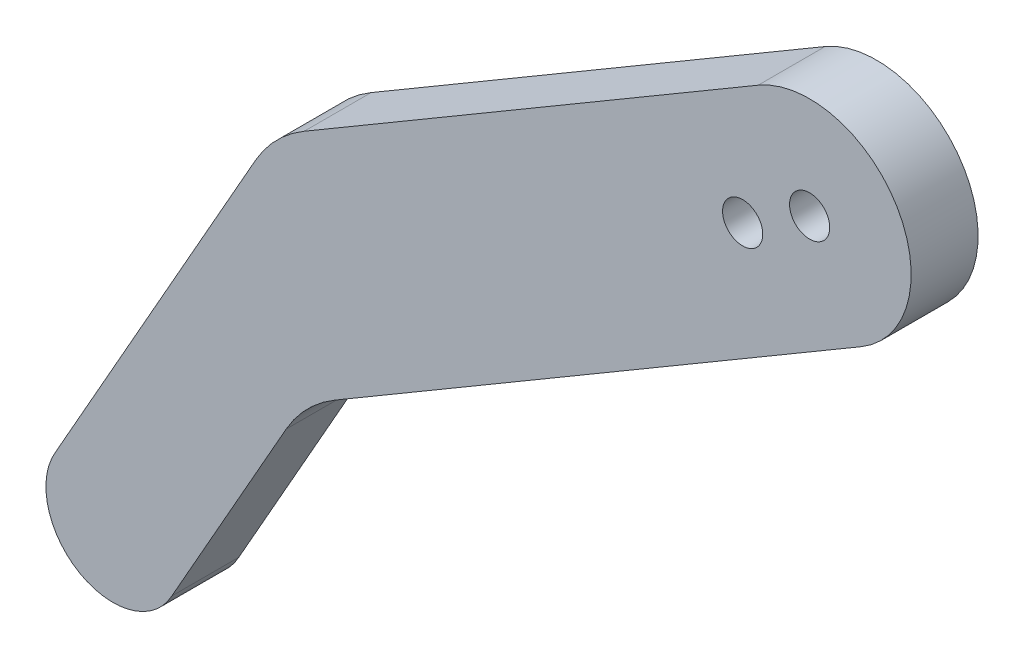
ISO-10303-21;
HEADER;
FILE_DESCRIPTION(('STEP AP214'),'2;1');
FILE_NAME('part.step','',(''),(''),'','','');
FILE_SCHEMA(('AUTOMOTIVE_DESIGN { 1 0 10303 214 1 1 1 1 }'));
ENDSEC;
DATA;
#1=APPLICATION_CONTEXT('core data for automotive mechanical design processes');
#2=APPLICATION_PROTOCOL_DEFINITION('international standard','automotive_design',2000,#1);
#3=PRODUCT_CONTEXT('',#1,'mechanical');
#4=PRODUCT('Part','Part','',(#3));
#5=PRODUCT_RELATED_PRODUCT_CATEGORY('part','',(#4));
#6=PRODUCT_DEFINITION_FORMATION('','',#4);
#7=PRODUCT_DEFINITION_CONTEXT('part definition',#1,'design');
#8=PRODUCT_DEFINITION('design','',#6,#7);
#9=PRODUCT_DEFINITION_SHAPE('','',#8);
#10=(LENGTH_UNIT() NAMED_UNIT(*) SI_UNIT(.MILLI.,.METRE.));
#11=(NAMED_UNIT(*) PLANE_ANGLE_UNIT() SI_UNIT($,.RADIAN.));
#12=(NAMED_UNIT(*) SI_UNIT($,.STERADIAN.) SOLID_ANGLE_UNIT());
#13=UNCERTAINTY_MEASURE_WITH_UNIT(LENGTH_MEASURE(1.E-05),#10,'distance_accuracy_value','');
#14=(GEOMETRIC_REPRESENTATION_CONTEXT(3) GLOBAL_UNCERTAINTY_ASSIGNED_CONTEXT((#13)) GLOBAL_UNIT_ASSIGNED_CONTEXT((#10,
#11,#12)) REPRESENTATION_CONTEXT('',''));
#15=CARTESIAN_POINT('',(0.,0.,0.));
#16=DIRECTION('',(0.,0.,1.));
#17=DIRECTION('',(1.,0.,0.));
#18=AXIS2_PLACEMENT_3D('',#15,#16,#17);
#19=CARTESIAN_POINT('',(8.69918007203384,-4.93196371380907,5.));
#20=DIRECTION('',(-0.869918007203384,0.493196371380907,0.));
#21=DIRECTION('',(-0.493196371380907,-0.869918007203384,0.));
#22=AXIS2_PLACEMENT_3D('',#19,#20,#21);
#23=PLANE('',#22);
#24=DIRECTION('',(0.493196371380907,0.869918007203384,0.));
#25=VECTOR('',#24,1.);
#26=CARTESIAN_POINT('',(8.69918007203384,-4.93196371380907,0.));
#27=LINE('',#26,#25);
#28=CARTESIAN_POINT('',(8.69918007203384,-4.93196371380907,0.));
#29=VERTEX_POINT('',#28);
#30=CARTESIAN_POINT('',(17.2415918054372,10.1354581551442,0.));
#31=VERTEX_POINT('',#30);
#32=EDGE_CURVE('E136',#29,#31,#27,.T.);
#33=ORIENTED_EDGE('',*,*,#32,.T.);
#34=DIRECTION('',(0.,0.,-1.));
#35=VECTOR('',#34,1.);
#36=CARTESIAN_POINT('',(17.2415918054372,10.1354581551442,5.));
#37=LINE('',#36,#35);
#38=CARTESIAN_POINT('',(17.2415918054372,10.1354581551442,5.));
#39=VERTEX_POINT('',#38);
#40=EDGE_CURVE('E11',#39,#31,#37,.T.);
#41=ORIENTED_EDGE('',*,*,#40,.F.);
#42=DIRECTION('',(0.493196371380907,0.869918007203384,0.));
#43=VECTOR('',#42,1.);
#44=CARTESIAN_POINT('',(8.69918007203384,-4.93196371380907,5.));
#45=LINE('',#44,#43);
#46=CARTESIAN_POINT('',(8.69918007203384,-4.93196371380907,5.));
#47=VERTEX_POINT('',#46);
#48=EDGE_CURVE('E155',#47,#39,#45,.T.);
#49=ORIENTED_EDGE('',*,*,#48,.F.);
#50=DIRECTION('',(0.,0.,-1.));
#51=VECTOR('',#50,1.);
#52=CARTESIAN_POINT('',(8.69918007203384,-4.93196371380907,5.));
#53=LINE('',#52,#51);
#54=EDGE_CURVE('E132',#47,#29,#53,.T.);
#55=ORIENTED_EDGE('',*,*,#54,.T.);
#56=EDGE_LOOP('',(#33,#41,#49,#55));
#57=FACE_BOUND('',#56,.T.);
#58=ADVANCED_FACE('F39',(#57),#23,.F.);
#59=CARTESIAN_POINT('',(25.9407718774711,5.20349444133515,5.));
#60=DIRECTION('',(0.,0.,-1.));
#61=DIRECTION('',(-1.,0.,0.));
#62=AXIS2_PLACEMENT_3D('',#59,#60,#61);
#63=CYLINDRICAL_SURFACE('',#62,9.99999999999999);
#64=CARTESIAN_POINT('',(25.9407718774711,5.20349444133515,0.));
#65=DIRECTION('',(0.,0.,1.));
#66=DIRECTION('',(1.,0.,0.));
#67=AXIS2_PLACEMENT_3D('',#64,#65,#66);
#68=CIRCLE('',#67,9.99999999999999);
#69=CARTESIAN_POINT('',(20.873042799899,13.8242903440538,0.));
#70=VERTEX_POINT('',#69);
#71=EDGE_CURVE('E139',#31,#70,#68,.F.);
#72=ORIENTED_EDGE('',*,*,#71,.T.);
#73=DIRECTION('',(0.,0.,-1.));
#74=VECTOR('',#73,1.);
#75=CARTESIAN_POINT('',(20.873042799899,13.8242903440538,5.));
#76=LINE('',#75,#74);
#77=CARTESIAN_POINT('',(20.873042799899,13.8242903440538,5.));
#78=VERTEX_POINT('',#77);
#79=EDGE_CURVE('E48',#78,#70,#76,.T.);
#80=ORIENTED_EDGE('',*,*,#79,.F.);
#81=CARTESIAN_POINT('',(25.9407718774711,5.20349444133515,5.));
#82=DIRECTION('',(0.,0.,1.));
#83=DIRECTION('',(1.,0.,0.));
#84=AXIS2_PLACEMENT_3D('',#81,#82,#83);
#85=CIRCLE('',#84,9.99999999999999);
#86=EDGE_CURVE('E96',#39,#78,#85,.F.);
#87=ORIENTED_EDGE('',*,*,#86,.F.);
#88=ORIENTED_EDGE('',*,*,#40,.T.);
#89=EDGE_LOOP('',(#72,#80,#87,#88));
#90=FACE_BOUND('',#89,.T.);
#91=ADVANCED_FACE('F205',(#90),#63,.F.);
#92=CARTESIAN_POINT('',(-0.678946956897586,1.1549676501235,5.));
#93=DIRECTION('',(-0.506772907757211,0.862079590271862,0.));
#94=DIRECTION('',(-0.862079590271862,-0.506772907757211,0.));
#95=AXIS2_PLACEMENT_3D('',#92,#93,#94);
#96=PLANE('',#95);
#97=DIRECTION('',(0.862079590271862,0.506772907757211,0.));
#98=VECTOR('',#97,1.);
#99=CARTESIAN_POINT('',(-0.678946956897586,1.1549676501235,0.));
#100=LINE('',#99,#98);
#101=CARTESIAN_POINT('',(60.1656290680845,36.9224107741523,0.));
#102=VERTEX_POINT('',#101);
#103=EDGE_CURVE('E142',#70,#102,#100,.T.);
#104=ORIENTED_EDGE('',*,*,#103,.T.);
#105=DIRECTION('',(0.,0.,-1.));
#106=VECTOR('',#105,1.);
#107=CARTESIAN_POINT('',(60.1656290680845,36.9224107741523,5.));
#108=LINE('',#107,#106);
#109=CARTESIAN_POINT('',(60.1656290680845,36.9224107741523,5.));
#110=VERTEX_POINT('',#109);
#111=EDGE_CURVE('E161',#110,#102,#108,.T.);
#112=ORIENTED_EDGE('',*,*,#111,.F.);
#113=DIRECTION('',(0.862079590271862,0.506772907757211,0.));
#114=VECTOR('',#113,1.);
#115=CARTESIAN_POINT('',(-0.678946956897586,1.1549676501235,5.));
#116=LINE('',#115,#114);
#117=EDGE_CURVE('E178',#78,#110,#116,.T.);
#118=ORIENTED_EDGE('',*,*,#117,.F.);
#119=ORIENTED_EDGE('',*,*,#79,.T.);
#120=EDGE_LOOP('',(#104,#112,#118,#119));
#121=FACE_BOUND('',#120,.T.);
#122=ADVANCED_FACE('F209',(#121),#96,.F.);
#123=CARTESIAN_POINT('',(56.3242260575364,43.4570835688334,5.));
#124=DIRECTION('',(0.,0.,-1.));
#125=DIRECTION('',(-1.,0.,0.));
#126=AXIS2_PLACEMENT_3D('',#123,#124,#125);
#127=CYLINDRICAL_SURFACE('',#126,7.58012701892218);
#128=CARTESIAN_POINT('',(56.3242260575364,43.4570835688334,0.));
#129=DIRECTION('',(0.,0.,1.));
#130=DIRECTION('',(1.,0.,0.));
#131=AXIS2_PLACEMENT_3D('',#128,#129,#130);
#132=CIRCLE('',#131,7.58012701892218);
#133=CARTESIAN_POINT('',(52.4828230469881,49.9917563635145,0.));
#134=VERTEX_POINT('',#133);
#135=EDGE_CURVE('E145',#134,#102,#132,.F.);
#136=ORIENTED_EDGE('',*,*,#135,.F.);
#137=DIRECTION('',(0.,0.,-1.));
#138=VECTOR('',#137,1.);
#139=CARTESIAN_POINT('',(52.4828230469881,49.9917563635145,5.));
#140=LINE('',#139,#138);
#141=CARTESIAN_POINT('',(52.4828230469881,49.9917563635145,5.));
#142=VERTEX_POINT('',#141);
#143=EDGE_CURVE('E159',#142,#134,#140,.T.);
#144=ORIENTED_EDGE('',*,*,#143,.F.);
#145=CARTESIAN_POINT('',(56.3242260575364,43.4570835688334,5.));
#146=DIRECTION('',(0.,0.,1.));
#147=DIRECTION('',(1.,0.,0.));
#148=AXIS2_PLACEMENT_3D('',#145,#146,#147);
#149=CIRCLE('',#148,7.58012701892218);
#150=EDGE_CURVE('E180',#142,#110,#149,.F.);
#151=ORIENTED_EDGE('',*,*,#150,.T.);
#152=ORIENTED_EDGE('',*,*,#111,.T.);
#153=EDGE_LOOP('',(#136,#144,#151,#152));
#154=FACE_BOUND('',#153,.T.);
#155=ADVANCED_FACE('F213',(#154),#127,.T.);
#156=CARTESIAN_POINT('',(-8.36175297799398,14.2243132394858,5.));
#157=DIRECTION('',(-0.50677290775721,0.862079590271863,0.));
#158=DIRECTION('',(-0.862079590271862,-0.50677290775721,0.));
#159=AXIS2_PLACEMENT_3D('',#156,#157,#158);
#160=PLANE('',#159);
#161=DIRECTION('',(0.862079590271863,0.50677290775721,0.));
#162=VECTOR('',#161,1.);
#163=CARTESIAN_POINT('',(-8.36175297799398,14.2243132394858,0.));
#164=LINE('',#163,#162);
#165=CARTESIAN_POINT('',(18.5854155558169,30.0651881515068,0.));
#166=VERTEX_POINT('',#165);
#167=EDGE_CURVE('E148',#166,#134,#164,.T.);
#168=ORIENTED_EDGE('',*,*,#167,.F.);
#169=DIRECTION('',(0.,0.,-1.));
#170=VECTOR('',#169,1.);
#171=CARTESIAN_POINT('',(18.5854155558169,30.0651881515068,5.));
#172=LINE('',#171,#170);
#173=CARTESIAN_POINT('',(18.5854155558169,30.0651881515068,5.));
#174=VERTEX_POINT('',#173);
#175=EDGE_CURVE('E121',#174,#166,#172,.T.);
#176=ORIENTED_EDGE('',*,*,#175,.F.);
#177=DIRECTION('',(0.862079590271863,0.50677290775721,0.));
#178=VECTOR('',#177,1.);
#179=CARTESIAN_POINT('',(-8.36175297799398,14.2243132394858,5.));
#180=LINE('',#179,#178);
#181=EDGE_CURVE('E128',#174,#142,#180,.T.);
#182=ORIENTED_EDGE('',*,*,#181,.T.);
#183=ORIENTED_EDGE('',*,*,#143,.T.);
#184=EDGE_LOOP('',(#168,#176,#182,#183));
#185=FACE_BOUND('',#184,.T.);
#186=ADVANCED_FACE('F184',(#185),#160,.T.);
#187=CARTESIAN_POINT('',(23.653144633389,21.4443922487882,5.));
#188=DIRECTION('',(0.,0.,-1.));
#189=DIRECTION('',(-1.,0.,0.));
#190=AXIS2_PLACEMENT_3D('',#187,#188,#189);
#191=CYLINDRICAL_SURFACE('',#190,10.);
#192=CARTESIAN_POINT('',(23.653144633389,21.4443922487882,0.));
#193=DIRECTION('',(0.,0.,1.));
#194=DIRECTION('',(1.,0.,0.));
#195=AXIS2_PLACEMENT_3D('',#192,#193,#194);
#196=CIRCLE('',#195,10.);
#197=CARTESIAN_POINT('',(14.9539645613552,26.3763559625973,0.));
#198=VERTEX_POINT('',#197);
#199=EDGE_CURVE('E116',#198,#166,#196,.F.);
#200=ORIENTED_EDGE('',*,*,#199,.F.);
#201=DIRECTION('',(0.,0.,-1.));
#202=VECTOR('',#201,1.);
#203=CARTESIAN_POINT('',(14.9539645613552,26.3763559625973,5.));
#204=LINE('',#203,#202);
#205=CARTESIAN_POINT('',(14.9539645613552,26.3763559625973,5.));
#206=VERTEX_POINT('',#205);
#207=EDGE_CURVE('E111',#206,#198,#204,.T.);
#208=ORIENTED_EDGE('',*,*,#207,.F.);
#209=CARTESIAN_POINT('',(23.653144633389,21.4443922487882,5.));
#210=DIRECTION('',(0.,0.,1.));
#211=DIRECTION('',(1.,0.,0.));
#212=AXIS2_PLACEMENT_3D('',#209,#210,#211);
#213=CIRCLE('',#212,10.);
#214=EDGE_CURVE('E114',#206,#174,#213,.F.);
#215=ORIENTED_EDGE('',*,*,#214,.T.);
#216=ORIENTED_EDGE('',*,*,#175,.T.);
#217=EDGE_LOOP('',(#200,#208,#215,#216));
#218=FACE_BOUND('',#217,.T.);
#219=ADVANCED_FACE('F113',(#218),#191,.T.);
#220=CARTESIAN_POINT('',(0.,0.,5.));
#221=DIRECTION('',(-0.869918007203384,0.493196371380907,0.));
#222=DIRECTION('',(-0.493196371380907,-0.869918007203384,0.));
#223=AXIS2_PLACEMENT_3D('',#220,#221,#222);
#224=PLANE('',#223);
#225=DIRECTION('',(0.493196371380907,0.869918007203384,0.));
#226=VECTOR('',#225,1.);
#227=CARTESIAN_POINT('',(0.,0.,0.));
#228=LINE('',#227,#226);
#229=CARTESIAN_POINT('',(0.,0.,0.));
#230=VERTEX_POINT('',#229);
#231=EDGE_CURVE('E152',#230,#198,#228,.T.);
#232=ORIENTED_EDGE('',*,*,#231,.F.);
#233=DIRECTION('',(0.,0.,-1.));
#234=VECTOR('',#233,1.);
#235=CARTESIAN_POINT('',(0.,0.,5.));
#236=LINE('',#235,#234);
#237=CARTESIAN_POINT('',(0.,0.,5.));
#238=VERTEX_POINT('',#237);
#239=EDGE_CURVE('E85',#238,#230,#236,.T.);
#240=ORIENTED_EDGE('',*,*,#239,.F.);
#241=DIRECTION('',(0.493196371380907,0.869918007203384,0.));
#242=VECTOR('',#241,1.);
#243=CARTESIAN_POINT('',(0.,0.,5.));
#244=LINE('',#243,#242);
#245=EDGE_CURVE('E125',#238,#206,#244,.T.);
#246=ORIENTED_EDGE('',*,*,#245,.T.);
#247=ORIENTED_EDGE('',*,*,#207,.T.);
#248=EDGE_LOOP('',(#232,#240,#246,#247));
#249=FACE_BOUND('',#248,.T.);
#250=ADVANCED_FACE('F130',(#249),#224,.T.);
#251=CARTESIAN_POINT('',(4.30532765313558,-2.54405348545767,5.));
#252=DIRECTION('',(0.,0.,-1.));
#253=DIRECTION('',(-1.,0.,0.));
#254=AXIS2_PLACEMENT_3D('',#251,#252,#253);
#255=CYLINDRICAL_SURFACE('',#254,5.00080536891042);
#256=CARTESIAN_POINT('',(4.30532765313558,-2.54405348545767,0.));
#257=DIRECTION('',(0.,0.,1.));
#258=DIRECTION('',(1.,0.,0.));
#259=AXIS2_PLACEMENT_3D('',#256,#257,#258);
#260=CIRCLE('',#259,5.00080536891042);
#261=EDGE_CURVE('E88',#230,#29,#260,.T.);
#262=ORIENTED_EDGE('',*,*,#261,.T.);
#263=ORIENTED_EDGE('',*,*,#54,.F.);
#264=CARTESIAN_POINT('',(4.30532765313558,-2.54405348545767,5.));
#265=DIRECTION('',(0.,0.,1.));
#266=DIRECTION('',(1.,0.,0.));
#267=AXIS2_PLACEMENT_3D('',#264,#265,#266);
#268=CIRCLE('',#267,5.00080536891042);
#269=EDGE_CURVE('E57',#238,#47,#268,.T.);
#270=ORIENTED_EDGE('',*,*,#269,.F.);
#271=ORIENTED_EDGE('',*,*,#239,.T.);
#272=EDGE_LOOP('',(#262,#263,#270,#271));
#273=FACE_BOUND('',#272,.T.);
#274=ADVANCED_FACE('F193',(#273),#255,.T.);
#275=CARTESIAN_POINT('',(0.,0.,5.));
#276=DIRECTION('',(0.,0.,1.));
#277=DIRECTION('',(1.,0.,0.));
#278=AXIS2_PLACEMENT_3D('',#275,#276,#277);
#279=PLANE('',#278);
#280=CARTESIAN_POINT('',(51.3242260575363,40.5178369292198,5.));
#281=DIRECTION('',(0.,0.,1.));
#282=DIRECTION('',(1.,0.,0.));
#283=AXIS2_PLACEMENT_3D('',#280,#281,#282);
#284=CIRCLE('',#283,1.5);
#285=CARTESIAN_POINT('',(52.8242260575363,40.5178369292198,5.));
#286=VERTEX_POINT('',#285);
#287=EDGE_CURVE('E173',#286,#286,#284,.T.);
#288=ORIENTED_EDGE('',*,*,#287,.F.);
#289=EDGE_LOOP('',(#288));
#290=FACE_BOUND('',#289,.T.);
#291=CARTESIAN_POINT('',(56.3242260575363,43.4570835688334,5.));
#292=DIRECTION('',(0.,0.,1.));
#293=DIRECTION('',(1.,0.,0.));
#294=AXIS2_PLACEMENT_3D('',#291,#292,#293);
#295=CIRCLE('',#294,1.5);
#296=CARTESIAN_POINT('',(57.8242260575363,43.4570835688334,5.));
#297=VERTEX_POINT('',#296);
#298=EDGE_CURVE('E165',#297,#297,#295,.T.);
#299=ORIENTED_EDGE('',*,*,#298,.F.);
#300=EDGE_LOOP('',(#299));
#301=FACE_BOUND('',#300,.T.);
#302=ORIENTED_EDGE('',*,*,#48,.T.);
#303=ORIENTED_EDGE('',*,*,#86,.T.);
#304=ORIENTED_EDGE('',*,*,#117,.T.);
#305=ORIENTED_EDGE('',*,*,#150,.F.);
#306=ORIENTED_EDGE('',*,*,#181,.F.);
#307=ORIENTED_EDGE('',*,*,#214,.F.);
#308=ORIENTED_EDGE('',*,*,#245,.F.);
#309=ORIENTED_EDGE('',*,*,#269,.T.);
#310=EDGE_LOOP('',(#302,#303,#304,#305,#306,#307,#308,#309));
#311=FACE_BOUND('',#310,.T.);
#312=ADVANCED_FACE('F124',(#290,#301,#311),#279,.T.);
#313=CARTESIAN_POINT('',(0.,0.,0.));
#314=DIRECTION('',(0.,0.,1.));
#315=DIRECTION('',(1.,0.,0.));
#316=AXIS2_PLACEMENT_3D('',#313,#314,#315);
#317=PLANE('',#316);
#318=CARTESIAN_POINT('',(51.3242260575363,40.5178369292198,0.));
#319=DIRECTION('',(0.,0.,1.));
#320=DIRECTION('',(1.,0.,0.));
#321=AXIS2_PLACEMENT_3D('',#318,#319,#320);
#322=CIRCLE('',#321,1.5);
#323=CARTESIAN_POINT('',(52.8242260575363,40.5178369292198,0.));
#324=VERTEX_POINT('',#323);
#325=EDGE_CURVE('E42',#324,#324,#322,.T.);
#326=ORIENTED_EDGE('',*,*,#325,.T.);
#327=EDGE_LOOP('',(#326));
#328=FACE_BOUND('',#327,.T.);
#329=CARTESIAN_POINT('',(56.3242260575363,43.4570835688334,0.));
#330=DIRECTION('',(0.,0.,1.));
#331=DIRECTION('',(1.,0.,0.));
#332=AXIS2_PLACEMENT_3D('',#329,#330,#331);
#333=CIRCLE('',#332,1.5);
#334=CARTESIAN_POINT('',(57.8242260575363,43.4570835688334,0.));
#335=VERTEX_POINT('',#334);
#336=EDGE_CURVE('E140',#335,#335,#333,.T.);
#337=ORIENTED_EDGE('',*,*,#336,.T.);
#338=EDGE_LOOP('',(#337));
#339=FACE_BOUND('',#338,.T.);
#340=ORIENTED_EDGE('',*,*,#32,.F.);
#341=ORIENTED_EDGE('',*,*,#261,.F.);
#342=ORIENTED_EDGE('',*,*,#231,.T.);
#343=ORIENTED_EDGE('',*,*,#199,.T.);
#344=ORIENTED_EDGE('',*,*,#167,.T.);
#345=ORIENTED_EDGE('',*,*,#135,.T.);
#346=ORIENTED_EDGE('',*,*,#103,.F.);
#347=ORIENTED_EDGE('',*,*,#71,.F.);
#348=EDGE_LOOP('',(#340,#341,#342,#343,#344,#345,#346,#347));
#349=FACE_BOUND('',#348,.T.);
#350=ADVANCED_FACE('F188',(#328,#339,#349),#317,.F.);
#351=CARTESIAN_POINT('',(56.3242260575363,43.4570835688334,-2.));
#352=DIRECTION('',(0.,0.,1.));
#353=DIRECTION('',(1.,0.,0.));
#354=AXIS2_PLACEMENT_3D('',#351,#352,#353);
#355=CYLINDRICAL_SURFACE('',#354,1.5);
#356=ORIENTED_EDGE('',*,*,#298,.T.);
#357=EDGE_LOOP('',(#356));
#358=FACE_BOUND('',#357,.T.);
#359=ORIENTED_EDGE('',*,*,#336,.F.);
#360=EDGE_LOOP('',(#359));
#361=FACE_BOUND('',#360,.T.);
#362=ADVANCED_FACE('F250',(#358,#361),#355,.F.);
#363=CARTESIAN_POINT('',(51.3242260575363,40.5178369292198,-2.));
#364=DIRECTION('',(0.,0.,1.));
#365=DIRECTION('',(1.,0.,0.));
#366=AXIS2_PLACEMENT_3D('',#363,#364,#365);
#367=CYLINDRICAL_SURFACE('',#366,1.5);
#368=ORIENTED_EDGE('',*,*,#287,.T.);
#369=EDGE_LOOP('',(#368));
#370=FACE_BOUND('',#369,.T.);
#371=ORIENTED_EDGE('',*,*,#325,.F.);
#372=EDGE_LOOP('',(#371));
#373=FACE_BOUND('',#372,.T.);
#374=ADVANCED_FACE('F259',(#370,#373),#367,.F.);
#375=CLOSED_SHELL('',(#58,#91,#122,#155,#186,#219,#250,#274,#312,#350,#362,#374));
#376=MANIFOLD_SOLID_BREP('B2',#375);
#377=ADVANCED_BREP_SHAPE_REPRESENTATION('',(#18,#376),#14);
#378=SHAPE_DEFINITION_REPRESENTATION(#9,#377);
ENDSEC;
END-ISO-10303-21;
